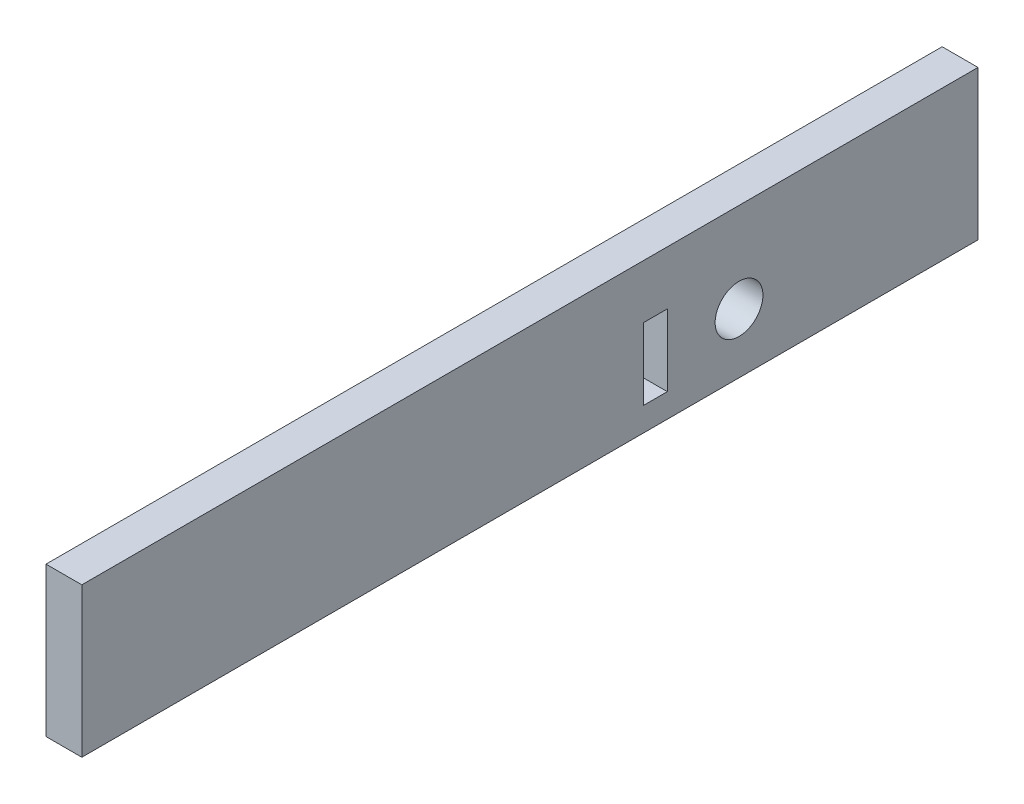
ISO-10303-21;
HEADER;
FILE_DESCRIPTION(('STEP AP214'),'2;1');
FILE_NAME('part.step','',(''),(''),'','','');
FILE_SCHEMA(('AUTOMOTIVE_DESIGN { 1 0 10303 214 1 1 1 1 }'));
ENDSEC;
DATA;
#1=APPLICATION_CONTEXT('core data for automotive mechanical design processes');
#2=APPLICATION_PROTOCOL_DEFINITION('international standard','automotive_design',2000,#1);
#3=PRODUCT_CONTEXT('',#1,'mechanical');
#4=PRODUCT('Part','Part','',(#3));
#5=PRODUCT_RELATED_PRODUCT_CATEGORY('part','',(#4));
#6=PRODUCT_DEFINITION_FORMATION('','',#4);
#7=PRODUCT_DEFINITION_CONTEXT('part definition',#1,'design');
#8=PRODUCT_DEFINITION('design','',#6,#7);
#9=PRODUCT_DEFINITION_SHAPE('','',#8);
#10=(LENGTH_UNIT() NAMED_UNIT(*) SI_UNIT(.MILLI.,.METRE.));
#11=(NAMED_UNIT(*) PLANE_ANGLE_UNIT() SI_UNIT($,.RADIAN.));
#12=(NAMED_UNIT(*) SI_UNIT($,.STERADIAN.) SOLID_ANGLE_UNIT());
#13=UNCERTAINTY_MEASURE_WITH_UNIT(LENGTH_MEASURE(1.E-05),#10,'distance_accuracy_value','');
#14=(GEOMETRIC_REPRESENTATION_CONTEXT(3) GLOBAL_UNCERTAINTY_ASSIGNED_CONTEXT((#13)) GLOBAL_UNIT_ASSIGNED_CONTEXT((#10,
#11,#12)) REPRESENTATION_CONTEXT('',''));
#15=CARTESIAN_POINT('',(0.,0.,0.));
#16=DIRECTION('',(0.,0.,1.));
#17=DIRECTION('',(1.,0.,0.));
#18=AXIS2_PLACEMENT_3D('',#15,#16,#17);
#19=CARTESIAN_POINT('',(6.,25.,0.));
#20=DIRECTION('',(-1.,0.,0.));
#21=DIRECTION('',(0.,0.,1.));
#22=AXIS2_PLACEMENT_3D('',#19,#20,#21);
#23=PLANE('',#22);
#24=CARTESIAN_POINT('',(6.,10.,-110.));
#25=DIRECTION('',(1.,0.,0.));
#26=DIRECTION('',(0.,0.,-1.));
#27=AXIS2_PLACEMENT_3D('',#24,#25,#26);
#28=CIRCLE('',#27,4.00000000000001);
#29=CARTESIAN_POINT('',(6.,10.,-114.));
#30=VERTEX_POINT('',#29);
#31=EDGE_CURVE('E133',#30,#30,#28,.T.);
#32=ORIENTED_EDGE('',*,*,#31,.F.);
#33=EDGE_LOOP('',(#32));
#34=FACE_BOUND('',#33,.T.);
#35=DIRECTION('',(0.,-1.,0.));
#36=VECTOR('',#35,1.);
#37=CARTESIAN_POINT('',(6.,0.,0.));
#38=LINE('',#37,#36);
#39=CARTESIAN_POINT('',(6.,25.,0.));
#40=VERTEX_POINT('',#39);
#41=CARTESIAN_POINT('',(6.,0.,0.));
#42=VERTEX_POINT('',#41);
#43=EDGE_CURVE('E139',#40,#42,#38,.T.);
#44=ORIENTED_EDGE('',*,*,#43,.T.);
#45=DIRECTION('',(0.,0.,-1.));
#46=VECTOR('',#45,1.);
#47=CARTESIAN_POINT('',(6.,0.,0.));
#48=LINE('',#47,#46);
#49=CARTESIAN_POINT('',(6.,0.,-150.));
#50=VERTEX_POINT('',#49);
#51=EDGE_CURVE('E142',#42,#50,#48,.T.);
#52=ORIENTED_EDGE('',*,*,#51,.T.);
#53=DIRECTION('',(0.,1.,0.));
#54=VECTOR('',#53,1.);
#55=CARTESIAN_POINT('',(6.,0.,-150.));
#56=LINE('',#55,#54);
#57=CARTESIAN_POINT('',(6.,25.,-150.));
#58=VERTEX_POINT('',#57);
#59=EDGE_CURVE('E145',#50,#58,#56,.T.);
#60=ORIENTED_EDGE('',*,*,#59,.T.);
#61=DIRECTION('',(0.,0.,1.));
#62=VECTOR('',#61,1.);
#63=CARTESIAN_POINT('',(6.,25.,0.));
#64=LINE('',#63,#62);
#65=EDGE_CURVE('E147',#58,#40,#64,.T.);
#66=ORIENTED_EDGE('',*,*,#65,.T.);
#67=EDGE_LOOP('',(#44,#52,#60,#66));
#68=FACE_BOUND('',#67,.T.);
#69=DIRECTION('',(0.,-1.,0.));
#70=VECTOR('',#69,1.);
#71=CARTESIAN_POINT('',(6.,16.,-94.));
#72=LINE('',#71,#70);
#73=CARTESIAN_POINT('',(6.,16.,-94.));
#74=VERTEX_POINT('',#73);
#75=CARTESIAN_POINT('',(6.,4.,-94.));
#76=VERTEX_POINT('',#75);
#77=EDGE_CURVE('E97',#74,#76,#72,.T.);
#78=ORIENTED_EDGE('',*,*,#77,.F.);
#79=DIRECTION('',(0.,0.,1.));
#80=VECTOR('',#79,1.);
#81=CARTESIAN_POINT('',(6.,16.,-94.));
#82=LINE('',#81,#80);
#83=CARTESIAN_POINT('',(6.,16.,-98.));
#84=VERTEX_POINT('',#83);
#85=EDGE_CURVE('E119',#84,#74,#82,.T.);
#86=ORIENTED_EDGE('',*,*,#85,.F.);
#87=DIRECTION('',(0.,1.,0.));
#88=VECTOR('',#87,1.);
#89=CARTESIAN_POINT('',(6.,16.,-98.));
#90=LINE('',#89,#88);
#91=CARTESIAN_POINT('',(6.,4.,-98.));
#92=VERTEX_POINT('',#91);
#93=EDGE_CURVE('E117',#92,#84,#90,.T.);
#94=ORIENTED_EDGE('',*,*,#93,.F.);
#95=DIRECTION('',(0.,0.,-1.));
#96=VECTOR('',#95,1.);
#97=CARTESIAN_POINT('',(6.,4.,-94.));
#98=LINE('',#97,#96);
#99=EDGE_CURVE('E105',#76,#92,#98,.T.);
#100=ORIENTED_EDGE('',*,*,#99,.F.);
#101=EDGE_LOOP('',(#78,#86,#94,#100));
#102=FACE_BOUND('',#101,.T.);
#103=ADVANCED_FACE('F32',(#34,#68,#102),#23,.F.);
#104=CARTESIAN_POINT('',(0.,25.,0.));
#105=DIRECTION('',(-1.,0.,0.));
#106=DIRECTION('',(0.,0.,1.));
#107=AXIS2_PLACEMENT_3D('',#104,#105,#106);
#108=PLANE('',#107);
#109=CARTESIAN_POINT('',(0.,10.,-110.));
#110=DIRECTION('',(1.,0.,0.));
#111=DIRECTION('',(0.,0.,-1.));
#112=AXIS2_PLACEMENT_3D('',#109,#110,#111);
#113=CIRCLE('',#112,4.00000000000001);
#114=CARTESIAN_POINT('',(0.,10.,-114.));
#115=VERTEX_POINT('',#114);
#116=EDGE_CURVE('E113',#115,#115,#113,.T.);
#117=ORIENTED_EDGE('',*,*,#116,.T.);
#118=EDGE_LOOP('',(#117));
#119=FACE_BOUND('',#118,.T.);
#120=DIRECTION('',(0.,-1.,0.));
#121=VECTOR('',#120,1.);
#122=CARTESIAN_POINT('',(0.,0.,0.));
#123=LINE('',#122,#121);
#124=CARTESIAN_POINT('',(0.,25.,0.));
#125=VERTEX_POINT('',#124);
#126=CARTESIAN_POINT('',(0.,0.,0.));
#127=VERTEX_POINT('',#126);
#128=EDGE_CURVE('E136',#125,#127,#123,.T.);
#129=ORIENTED_EDGE('',*,*,#128,.F.);
#130=DIRECTION('',(0.,0.,1.));
#131=VECTOR('',#130,1.);
#132=CARTESIAN_POINT('',(0.,25.,0.));
#133=LINE('',#132,#131);
#134=CARTESIAN_POINT('',(0.,25.,-150.));
#135=VERTEX_POINT('',#134);
#136=EDGE_CURVE('E143',#135,#125,#133,.T.);
#137=ORIENTED_EDGE('',*,*,#136,.F.);
#138=DIRECTION('',(0.,1.,0.));
#139=VECTOR('',#138,1.);
#140=CARTESIAN_POINT('',(0.,0.,-150.));
#141=LINE('',#140,#139);
#142=CARTESIAN_POINT('',(0.,0.,-150.));
#143=VERTEX_POINT('',#142);
#144=EDGE_CURVE('E154',#143,#135,#141,.T.);
#145=ORIENTED_EDGE('',*,*,#144,.F.);
#146=DIRECTION('',(0.,0.,-1.));
#147=VECTOR('',#146,1.);
#148=CARTESIAN_POINT('',(0.,0.,0.));
#149=LINE('',#148,#147);
#150=EDGE_CURVE('E152',#127,#143,#149,.T.);
#151=ORIENTED_EDGE('',*,*,#150,.F.);
#152=EDGE_LOOP('',(#129,#137,#145,#151));
#153=FACE_BOUND('',#152,.T.);
#154=DIRECTION('',(0.,0.,1.));
#155=VECTOR('',#154,1.);
#156=CARTESIAN_POINT('',(0.,16.,-94.));
#157=LINE('',#156,#155);
#158=CARTESIAN_POINT('',(0.,16.,-98.));
#159=VERTEX_POINT('',#158);
#160=CARTESIAN_POINT('',(0.,16.,-94.));
#161=VERTEX_POINT('',#160);
#162=EDGE_CURVE('E106',#159,#161,#157,.T.);
#163=ORIENTED_EDGE('',*,*,#162,.T.);
#164=DIRECTION('',(0.,-1.,0.));
#165=VECTOR('',#164,1.);
#166=CARTESIAN_POINT('',(0.,16.,-94.));
#167=LINE('',#166,#165);
#168=CARTESIAN_POINT('',(0.,4.,-94.));
#169=VERTEX_POINT('',#168);
#170=EDGE_CURVE('E55',#161,#169,#167,.T.);
#171=ORIENTED_EDGE('',*,*,#170,.T.);
#172=DIRECTION('',(0.,0.,-1.));
#173=VECTOR('',#172,1.);
#174=CARTESIAN_POINT('',(0.,4.,-94.));
#175=LINE('',#174,#173);
#176=CARTESIAN_POINT('',(0.,4.,-98.));
#177=VERTEX_POINT('',#176);
#178=EDGE_CURVE('E112',#169,#177,#175,.T.);
#179=ORIENTED_EDGE('',*,*,#178,.T.);
#180=DIRECTION('',(0.,1.,0.));
#181=VECTOR('',#180,1.);
#182=CARTESIAN_POINT('',(0.,16.,-98.));
#183=LINE('',#182,#181);
#184=EDGE_CURVE('E125',#177,#159,#183,.T.);
#185=ORIENTED_EDGE('',*,*,#184,.T.);
#186=EDGE_LOOP('',(#163,#171,#179,#185));
#187=FACE_BOUND('',#186,.T.);
#188=ADVANCED_FACE('F172',(#119,#153,#187),#108,.T.);
#189=CARTESIAN_POINT('',(6.,0.,0.));
#190=DIRECTION('',(0.,0.,-1.));
#191=DIRECTION('',(-1.,0.,0.));
#192=AXIS2_PLACEMENT_3D('',#189,#190,#191);
#193=PLANE('',#192);
#194=ORIENTED_EDGE('',*,*,#128,.T.);
#195=DIRECTION('',(-1.,0.,0.));
#196=VECTOR('',#195,1.);
#197=CARTESIAN_POINT('',(6.,0.,0.));
#198=LINE('',#197,#196);
#199=EDGE_CURVE('E11',#42,#127,#198,.T.);
#200=ORIENTED_EDGE('',*,*,#199,.F.);
#201=ORIENTED_EDGE('',*,*,#43,.F.);
#202=DIRECTION('',(-1.,0.,0.));
#203=VECTOR('',#202,1.);
#204=CARTESIAN_POINT('',(6.,25.,0.));
#205=LINE('',#204,#203);
#206=EDGE_CURVE('E149',#40,#125,#205,.T.);
#207=ORIENTED_EDGE('',*,*,#206,.T.);
#208=EDGE_LOOP('',(#194,#200,#201,#207));
#209=FACE_BOUND('',#208,.T.);
#210=ADVANCED_FACE('F34',(#209),#193,.F.);
#211=CARTESIAN_POINT('',(6.,0.,0.));
#212=DIRECTION('',(0.,1.,0.));
#213=DIRECTION('',(0.,0.,1.));
#214=AXIS2_PLACEMENT_3D('',#211,#212,#213);
#215=PLANE('',#214);
#216=ORIENTED_EDGE('',*,*,#150,.T.);
#217=DIRECTION('',(-1.,0.,0.));
#218=VECTOR('',#217,1.);
#219=CARTESIAN_POINT('',(6.,0.,-150.));
#220=LINE('',#219,#218);
#221=EDGE_CURVE('E40',#50,#143,#220,.T.);
#222=ORIENTED_EDGE('',*,*,#221,.F.);
#223=ORIENTED_EDGE('',*,*,#51,.F.);
#224=ORIENTED_EDGE('',*,*,#199,.T.);
#225=EDGE_LOOP('',(#216,#222,#223,#224));
#226=FACE_BOUND('',#225,.T.);
#227=ADVANCED_FACE('F182',(#226),#215,.F.);
#228=CARTESIAN_POINT('',(6.,0.,-150.));
#229=DIRECTION('',(0.,0.,1.));
#230=DIRECTION('',(1.,0.,0.));
#231=AXIS2_PLACEMENT_3D('',#228,#229,#230);
#232=PLANE('',#231);
#233=ORIENTED_EDGE('',*,*,#144,.T.);
#234=DIRECTION('',(-1.,0.,0.));
#235=VECTOR('',#234,1.);
#236=CARTESIAN_POINT('',(6.,25.,-150.));
#237=LINE('',#236,#235);
#238=EDGE_CURVE('E159',#58,#135,#237,.T.);
#239=ORIENTED_EDGE('',*,*,#238,.F.);
#240=ORIENTED_EDGE('',*,*,#59,.F.);
#241=ORIENTED_EDGE('',*,*,#221,.T.);
#242=EDGE_LOOP('',(#233,#239,#240,#241));
#243=FACE_BOUND('',#242,.T.);
#244=ADVANCED_FACE('F166',(#243),#232,.F.);
#245=CARTESIAN_POINT('',(6.,25.,0.));
#246=DIRECTION('',(0.,-1.,0.));
#247=DIRECTION('',(0.,0.,-1.));
#248=AXIS2_PLACEMENT_3D('',#245,#246,#247);
#249=PLANE('',#248);
#250=ORIENTED_EDGE('',*,*,#136,.T.);
#251=ORIENTED_EDGE('',*,*,#206,.F.);
#252=ORIENTED_EDGE('',*,*,#65,.F.);
#253=ORIENTED_EDGE('',*,*,#238,.T.);
#254=EDGE_LOOP('',(#250,#251,#252,#253));
#255=FACE_BOUND('',#254,.T.);
#256=ADVANCED_FACE('F176',(#255),#249,.F.);
#257=CARTESIAN_POINT('',(6.,10.,-110.));
#258=DIRECTION('',(-1.,0.,0.));
#259=DIRECTION('',(0.,0.,1.));
#260=AXIS2_PLACEMENT_3D('',#257,#258,#259);
#261=CYLINDRICAL_SURFACE('',#260,4.00000000000001);
#262=ORIENTED_EDGE('',*,*,#31,.T.);
#263=EDGE_LOOP('',(#262));
#264=FACE_BOUND('',#263,.T.);
#265=ORIENTED_EDGE('',*,*,#116,.F.);
#266=EDGE_LOOP('',(#265));
#267=FACE_BOUND('',#266,.T.);
#268=ADVANCED_FACE('F199',(#264,#267),#261,.F.);
#269=CARTESIAN_POINT('',(6.,16.,-94.));
#270=DIRECTION('',(0.,0.,-1.));
#271=DIRECTION('',(-1.,0.,0.));
#272=AXIS2_PLACEMENT_3D('',#269,#270,#271);
#273=PLANE('',#272);
#274=ORIENTED_EDGE('',*,*,#170,.F.);
#275=DIRECTION('',(-1.,0.,0.));
#276=VECTOR('',#275,1.);
#277=CARTESIAN_POINT('',(6.,16.,-94.));
#278=LINE('',#277,#276);
#279=EDGE_CURVE('E101',#74,#161,#278,.T.);
#280=ORIENTED_EDGE('',*,*,#279,.F.);
#281=ORIENTED_EDGE('',*,*,#77,.T.);
#282=DIRECTION('',(-1.,0.,0.));
#283=VECTOR('',#282,1.);
#284=CARTESIAN_POINT('',(6.,4.,-94.));
#285=LINE('',#284,#283);
#286=EDGE_CURVE('E100',#76,#169,#285,.T.);
#287=ORIENTED_EDGE('',*,*,#286,.T.);
#288=EDGE_LOOP('',(#274,#280,#281,#287));
#289=FACE_BOUND('',#288,.T.);
#290=ADVANCED_FACE('F99',(#289),#273,.T.);
#291=CARTESIAN_POINT('',(6.,4.,-94.));
#292=DIRECTION('',(0.,1.,0.));
#293=DIRECTION('',(0.,0.,1.));
#294=AXIS2_PLACEMENT_3D('',#291,#292,#293);
#295=PLANE('',#294);
#296=ORIENTED_EDGE('',*,*,#178,.F.);
#297=ORIENTED_EDGE('',*,*,#286,.F.);
#298=ORIENTED_EDGE('',*,*,#99,.T.);
#299=DIRECTION('',(-1.,0.,0.));
#300=VECTOR('',#299,1.);
#301=CARTESIAN_POINT('',(6.,4.,-98.));
#302=LINE('',#301,#300);
#303=EDGE_CURVE('E114',#92,#177,#302,.T.);
#304=ORIENTED_EDGE('',*,*,#303,.T.);
#305=EDGE_LOOP('',(#296,#297,#298,#304));
#306=FACE_BOUND('',#305,.T.);
#307=ADVANCED_FACE('F109',(#306),#295,.T.);
#308=CARTESIAN_POINT('',(6.,16.,-98.));
#309=DIRECTION('',(0.,0.,1.));
#310=DIRECTION('',(1.,0.,0.));
#311=AXIS2_PLACEMENT_3D('',#308,#309,#310);
#312=PLANE('',#311);
#313=ORIENTED_EDGE('',*,*,#184,.F.);
#314=ORIENTED_EDGE('',*,*,#303,.F.);
#315=ORIENTED_EDGE('',*,*,#93,.T.);
#316=DIRECTION('',(-1.,0.,0.));
#317=VECTOR('',#316,1.);
#318=CARTESIAN_POINT('',(6.,16.,-98.));
#319=LINE('',#318,#317);
#320=EDGE_CURVE('E47',#84,#159,#319,.T.);
#321=ORIENTED_EDGE('',*,*,#320,.T.);
#322=EDGE_LOOP('',(#313,#314,#315,#321));
#323=FACE_BOUND('',#322,.T.);
#324=ADVANCED_FACE('F215',(#323),#312,.T.);
#325=CARTESIAN_POINT('',(6.,16.,-94.));
#326=DIRECTION('',(0.,-1.,0.));
#327=DIRECTION('',(0.,0.,-1.));
#328=AXIS2_PLACEMENT_3D('',#325,#326,#327);
#329=PLANE('',#328);
#330=ORIENTED_EDGE('',*,*,#162,.F.);
#331=ORIENTED_EDGE('',*,*,#320,.F.);
#332=ORIENTED_EDGE('',*,*,#85,.T.);
#333=ORIENTED_EDGE('',*,*,#279,.T.);
#334=EDGE_LOOP('',(#330,#331,#332,#333));
#335=FACE_BOUND('',#334,.T.);
#336=ADVANCED_FACE('F220',(#335),#329,.T.);
#337=CLOSED_SHELL('',(#103,#188,#210,#227,#244,#256,#268,#290,#307,#324,#336));
#338=MANIFOLD_SOLID_BREP('B2',#337);
#339=ADVANCED_BREP_SHAPE_REPRESENTATION('',(#18,#338),#14);
#340=SHAPE_DEFINITION_REPRESENTATION(#9,#339);
ENDSEC;
END-ISO-10303-21;
